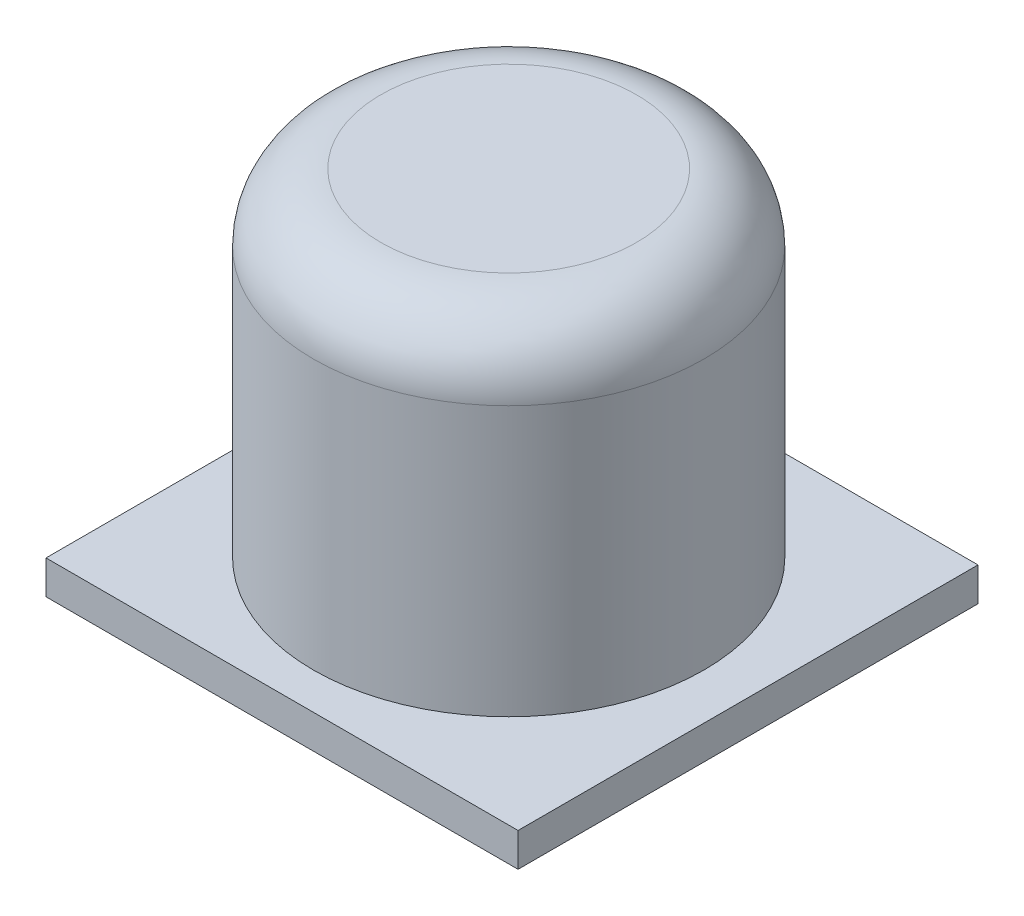
ISO-10303-21;
HEADER;
FILE_DESCRIPTION(('STEP AP214'),'2;1');
FILE_NAME('part.step','',(''),(''),'','','');
FILE_SCHEMA(('AUTOMOTIVE_DESIGN { 1 0 10303 214 1 1 1 1 }'));
ENDSEC;
DATA;
#1=APPLICATION_CONTEXT('core data for automotive mechanical design processes');
#2=APPLICATION_PROTOCOL_DEFINITION('international standard','automotive_design',2000,#1);
#3=PRODUCT_CONTEXT('',#1,'mechanical');
#4=PRODUCT('Part','Part','',(#3));
#5=PRODUCT_RELATED_PRODUCT_CATEGORY('part','',(#4));
#6=PRODUCT_DEFINITION_FORMATION('','',#4);
#7=PRODUCT_DEFINITION_CONTEXT('part definition',#1,'design');
#8=PRODUCT_DEFINITION('design','',#6,#7);
#9=PRODUCT_DEFINITION_SHAPE('','',#8);
#10=(LENGTH_UNIT() NAMED_UNIT(*) SI_UNIT(.MILLI.,.METRE.));
#11=(NAMED_UNIT(*) PLANE_ANGLE_UNIT() SI_UNIT($,.RADIAN.));
#12=(NAMED_UNIT(*) SI_UNIT($,.STERADIAN.) SOLID_ANGLE_UNIT());
#13=UNCERTAINTY_MEASURE_WITH_UNIT(LENGTH_MEASURE(1.E-05),#10,'distance_accuracy_value','');
#14=(GEOMETRIC_REPRESENTATION_CONTEXT(3) GLOBAL_UNCERTAINTY_ASSIGNED_CONTEXT((#13)) GLOBAL_UNIT_ASSIGNED_CONTEXT((#10,
#11,#12)) REPRESENTATION_CONTEXT('',''));
#15=CARTESIAN_POINT('',(0.,0.,0.));
#16=DIRECTION('',(0.,0.,1.));
#17=DIRECTION('',(1.,0.,0.));
#18=AXIS2_PLACEMENT_3D('',#15,#16,#17);
#19=CARTESIAN_POINT('',(0.,-0.5,0.));
#20=DIRECTION('',(0.,1.,0.));
#21=DIRECTION('',(0.,0.,1.));
#22=AXIS2_PLACEMENT_3D('',#19,#20,#21);
#23=CYLINDRICAL_SURFACE('',#22,2.9);
#24=CARTESIAN_POINT('',(0.,4.,0.));
#25=DIRECTION('',(0.,1.,0.));
#26=DIRECTION('',(0.,0.,1.));
#27=AXIS2_PLACEMENT_3D('',#24,#25,#26);
#28=CIRCLE('',#27,2.9);
#29=CARTESIAN_POINT('',(0.,4.,2.9));
#30=VERTEX_POINT('',#29);
#31=EDGE_CURVE('E11',#30,#30,#28,.F.);
#32=ORIENTED_EDGE('',*,*,#31,.T.);
#33=EDGE_LOOP('',(#32));
#34=FACE_BOUND('',#33,.T.);
#35=CARTESIAN_POINT('',(0.,0.,0.));
#36=DIRECTION('',(0.,1.,0.));
#37=DIRECTION('',(0.,0.,1.));
#38=AXIS2_PLACEMENT_3D('',#35,#36,#37);
#39=CIRCLE('',#38,2.9);
#40=CARTESIAN_POINT('',(0.,0.,2.9));
#41=VERTEX_POINT('',#40);
#42=EDGE_CURVE('E110',#41,#41,#39,.F.);
#43=ORIENTED_EDGE('',*,*,#42,.F.);
#44=EDGE_LOOP('',(#43));
#45=FACE_BOUND('',#44,.T.);
#46=ADVANCED_FACE('F33',(#34,#45),#23,.T.);
#47=CARTESIAN_POINT('',(0.,5.,0.));
#48=DIRECTION('',(0.,1.,0.));
#49=DIRECTION('',(0.,0.,1.));
#50=AXIS2_PLACEMENT_3D('',#47,#48,#49);
#51=PLANE('',#50);
#52=CARTESIAN_POINT('',(0.,5.,0.));
#53=DIRECTION('',(0.,1.,0.));
#54=DIRECTION('',(0.,0.,1.));
#55=AXIS2_PLACEMENT_3D('',#52,#53,#54);
#56=CIRCLE('',#55,1.9);
#57=CARTESIAN_POINT('',(0.,5.,1.9));
#58=VERTEX_POINT('',#57);
#59=EDGE_CURVE('E42',#58,#58,#56,.T.);
#60=ORIENTED_EDGE('',*,*,#59,.T.);
#61=EDGE_LOOP('',(#60));
#62=FACE_BOUND('',#61,.T.);
#63=ADVANCED_FACE('F117',(#62),#51,.T.);
#64=CARTESIAN_POINT('',(-3.42828361630515,-0.5,-3.38775085779996));
#65=DIRECTION('',(-1.,0.,0.));
#66=DIRECTION('',(0.,0.,1.));
#67=AXIS2_PLACEMENT_3D('',#64,#65,#66);
#68=PLANE('',#67);
#69=DIRECTION('',(0.,0.,1.));
#70=VECTOR('',#69,1.);
#71=CARTESIAN_POINT('',(-3.42828361630515,0.,-3.38775085779996));
#72=LINE('',#71,#70);
#73=CARTESIAN_POINT('',(-3.42828361630515,0.,-3.38775085779996));
#74=VERTEX_POINT('',#73);
#75=CARTESIAN_POINT('',(-3.42828361630515,0.,3.44325503846843));
#76=VERTEX_POINT('',#75);
#77=EDGE_CURVE('E101',#74,#76,#72,.T.);
#78=ORIENTED_EDGE('',*,*,#77,.F.);
#79=DIRECTION('',(0.,1.,0.));
#80=VECTOR('',#79,1.);
#81=CARTESIAN_POINT('',(-3.42828361630515,-0.5,-3.38775085779996));
#82=LINE('',#81,#80);
#83=CARTESIAN_POINT('',(-3.42828361630515,-0.5,-3.38775085779996));
#84=VERTEX_POINT('',#83);
#85=EDGE_CURVE('E50',#84,#74,#82,.T.);
#86=ORIENTED_EDGE('',*,*,#85,.F.);
#87=DIRECTION('',(0.,0.,1.));
#88=VECTOR('',#87,1.);
#89=CARTESIAN_POINT('',(-3.42828361630515,-0.5,-3.38775085779996));
#90=LINE('',#89,#88);
#91=CARTESIAN_POINT('',(-3.42828361630515,-0.5,3.44325503846843));
#92=VERTEX_POINT('',#91);
#93=EDGE_CURVE('E95',#84,#92,#90,.T.);
#94=ORIENTED_EDGE('',*,*,#93,.T.);
#95=DIRECTION('',(0.,1.,0.));
#96=VECTOR('',#95,1.);
#97=CARTESIAN_POINT('',(-3.42828361630515,-0.5,3.44325503846843));
#98=LINE('',#97,#96);
#99=EDGE_CURVE('E78',#92,#76,#98,.T.);
#100=ORIENTED_EDGE('',*,*,#99,.T.);
#101=EDGE_LOOP('',(#78,#86,#94,#100));
#102=FACE_BOUND('',#101,.T.);
#103=ADVANCED_FACE('F132',(#102),#68,.T.);
#104=CARTESIAN_POINT('',(-3.42828361630515,-0.5,-3.38775085779996));
#105=DIRECTION('',(0.,0.,-1.));
#106=DIRECTION('',(-1.,0.,0.));
#107=AXIS2_PLACEMENT_3D('',#104,#105,#106);
#108=PLANE('',#107);
#109=DIRECTION('',(-1.,0.,0.));
#110=VECTOR('',#109,1.);
#111=CARTESIAN_POINT('',(-3.42828361630515,0.,-3.38775085779996));
#112=LINE('',#111,#110);
#113=CARTESIAN_POINT('',(3.5825508656866,0.,-3.38775085779996));
#114=VERTEX_POINT('',#113);
#115=EDGE_CURVE('E97',#114,#74,#112,.T.);
#116=ORIENTED_EDGE('',*,*,#115,.F.);
#117=DIRECTION('',(0.,1.,0.));
#118=VECTOR('',#117,1.);
#119=CARTESIAN_POINT('',(3.5825508656866,-0.5,-3.38775085779996));
#120=LINE('',#119,#118);
#121=CARTESIAN_POINT('',(3.5825508656866,-0.5,-3.38775085779996));
#122=VERTEX_POINT('',#121);
#123=EDGE_CURVE('E67',#122,#114,#120,.T.);
#124=ORIENTED_EDGE('',*,*,#123,.F.);
#125=DIRECTION('',(-1.,0.,0.));
#126=VECTOR('',#125,1.);
#127=CARTESIAN_POINT('',(-3.42828361630515,-0.5,-3.38775085779996));
#128=LINE('',#127,#126);
#129=EDGE_CURVE('E92',#122,#84,#128,.T.);
#130=ORIENTED_EDGE('',*,*,#129,.T.);
#131=ORIENTED_EDGE('',*,*,#85,.T.);
#132=EDGE_LOOP('',(#116,#124,#130,#131));
#133=FACE_BOUND('',#132,.T.);
#134=ADVANCED_FACE('F138',(#133),#108,.T.);
#135=CARTESIAN_POINT('',(3.5825508656866,-0.5,-3.38775085779996));
#136=DIRECTION('',(1.,0.,0.));
#137=DIRECTION('',(0.,0.,-1.));
#138=AXIS2_PLACEMENT_3D('',#135,#136,#137);
#139=PLANE('',#138);
#140=DIRECTION('',(0.,0.,-1.));
#141=VECTOR('',#140,1.);
#142=CARTESIAN_POINT('',(3.5825508656866,0.,-3.38775085779996));
#143=LINE('',#142,#141);
#144=CARTESIAN_POINT('',(3.5825508656866,0.,3.44325503846843));
#145=VERTEX_POINT('',#144);
#146=EDGE_CURVE('E86',#145,#114,#143,.T.);
#147=ORIENTED_EDGE('',*,*,#146,.F.);
#148=DIRECTION('',(0.,1.,0.));
#149=VECTOR('',#148,1.);
#150=CARTESIAN_POINT('',(3.5825508656866,-0.5,3.44325503846843));
#151=LINE('',#150,#149);
#152=CARTESIAN_POINT('',(3.5825508656866,-0.5,3.44325503846843));
#153=VERTEX_POINT('',#152);
#154=EDGE_CURVE('E81',#153,#145,#151,.T.);
#155=ORIENTED_EDGE('',*,*,#154,.F.);
#156=DIRECTION('',(0.,0.,-1.));
#157=VECTOR('',#156,1.);
#158=CARTESIAN_POINT('',(3.5825508656866,-0.5,-3.38775085779996));
#159=LINE('',#158,#157);
#160=EDGE_CURVE('E84',#153,#122,#159,.T.);
#161=ORIENTED_EDGE('',*,*,#160,.T.);
#162=ORIENTED_EDGE('',*,*,#123,.T.);
#163=EDGE_LOOP('',(#147,#155,#161,#162));
#164=FACE_BOUND('',#163,.T.);
#165=ADVANCED_FACE('F83',(#164),#139,.T.);
#166=CARTESIAN_POINT('',(-3.42828361630515,-0.5,3.44325503846843));
#167=DIRECTION('',(0.,0.,1.));
#168=DIRECTION('',(1.,0.,0.));
#169=AXIS2_PLACEMENT_3D('',#166,#167,#168);
#170=PLANE('',#169);
#171=DIRECTION('',(1.,0.,0.));
#172=VECTOR('',#171,1.);
#173=CARTESIAN_POINT('',(-3.42828361630515,0.,3.44325503846843));
#174=LINE('',#173,#172);
#175=EDGE_CURVE('E104',#76,#145,#174,.T.);
#176=ORIENTED_EDGE('',*,*,#175,.F.);
#177=ORIENTED_EDGE('',*,*,#99,.F.);
#178=DIRECTION('',(1.,0.,0.));
#179=VECTOR('',#178,1.);
#180=CARTESIAN_POINT('',(-3.42828361630515,-0.5,3.44325503846843));
#181=LINE('',#180,#179);
#182=EDGE_CURVE('E91',#92,#153,#181,.T.);
#183=ORIENTED_EDGE('',*,*,#182,.T.);
#184=ORIENTED_EDGE('',*,*,#154,.T.);
#185=EDGE_LOOP('',(#176,#177,#183,#184));
#186=FACE_BOUND('',#185,.T.);
#187=ADVANCED_FACE('F94',(#186),#170,.T.);
#188=CARTESIAN_POINT('',(0.,0.,0.));
#189=DIRECTION('',(0.,1.,0.));
#190=DIRECTION('',(0.,0.,1.));
#191=AXIS2_PLACEMENT_3D('',#188,#189,#190);
#192=PLANE('',#191);
#193=ORIENTED_EDGE('',*,*,#42,.T.);
#194=EDGE_LOOP('',(#193));
#195=FACE_BOUND('',#194,.T.);
#196=ORIENTED_EDGE('',*,*,#77,.T.);
#197=ORIENTED_EDGE('',*,*,#175,.T.);
#198=ORIENTED_EDGE('',*,*,#146,.T.);
#199=ORIENTED_EDGE('',*,*,#115,.T.);
#200=EDGE_LOOP('',(#196,#197,#198,#199));
#201=FACE_BOUND('',#200,.T.);
#202=ADVANCED_FACE('F124',(#195,#201),#192,.T.);
#203=CARTESIAN_POINT('',(0.,-0.5,0.));
#204=DIRECTION('',(0.,1.,0.));
#205=DIRECTION('',(0.,0.,1.));
#206=AXIS2_PLACEMENT_3D('',#203,#204,#205);
#207=PLANE('',#206);
#208=ORIENTED_EDGE('',*,*,#93,.F.);
#209=ORIENTED_EDGE('',*,*,#129,.F.);
#210=ORIENTED_EDGE('',*,*,#160,.F.);
#211=ORIENTED_EDGE('',*,*,#182,.F.);
#212=EDGE_LOOP('',(#208,#209,#210,#211));
#213=FACE_BOUND('',#212,.T.);
#214=ADVANCED_FACE('F90',(#213),#207,.F.);
#215=CARTESIAN_POINT('',(0.,4.,0.));
#216=DIRECTION('',(0.,1.,0.));
#217=DIRECTION('',(0.,0.,1.));
#218=AXIS2_PLACEMENT_3D('',#215,#216,#217);
#219=TOROIDAL_SURFACE('',#218,1.9,1.);
#220=ORIENTED_EDGE('',*,*,#31,.F.);
#221=EDGE_LOOP('',(#220));
#222=FACE_BOUND('',#221,.T.);
#223=ORIENTED_EDGE('',*,*,#59,.F.);
#224=EDGE_LOOP('',(#223));
#225=FACE_BOUND('',#224,.T.);
#226=ADVANCED_FACE('F35',(#222,#225),#219,.T.);
#227=CLOSED_SHELL('',(#46,#63,#103,#134,#165,#187,#202,#214,#226));
#228=MANIFOLD_SOLID_BREP('B2',#227);
#229=ADVANCED_BREP_SHAPE_REPRESENTATION('',(#18,#228),#14);
#230=SHAPE_DEFINITION_REPRESENTATION(#9,#229);
ENDSEC;
END-ISO-10303-21;
